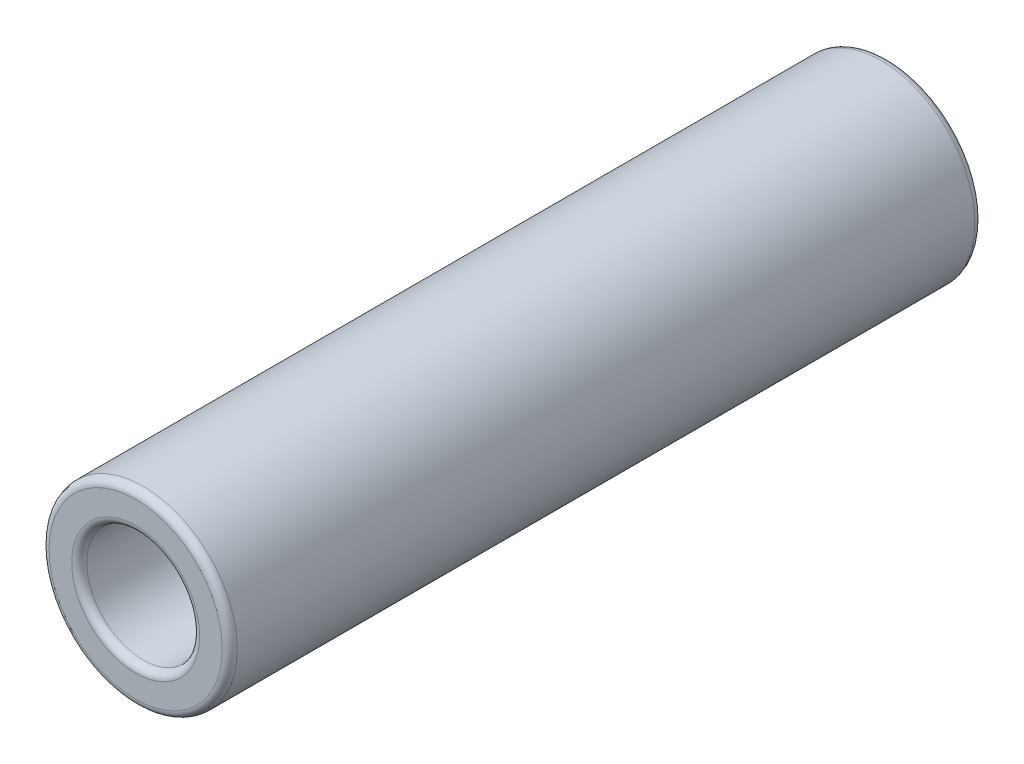
ISO-10303-21;
HEADER;
FILE_DESCRIPTION(('STEP AP214'),'2;1');
FILE_NAME('part.step','',(''),(''),'','','');
FILE_SCHEMA(('AUTOMOTIVE_DESIGN { 1 0 10303 214 1 1 1 1 }'));
ENDSEC;
DATA;
#1=APPLICATION_CONTEXT('core data for automotive mechanical design processes');
#2=APPLICATION_PROTOCOL_DEFINITION('international standard','automotive_design',2000,#1);
#3=PRODUCT_CONTEXT('',#1,'mechanical');
#4=PRODUCT('Part','Part','',(#3));
#5=PRODUCT_RELATED_PRODUCT_CATEGORY('part','',(#4));
#6=PRODUCT_DEFINITION_FORMATION('','',#4);
#7=PRODUCT_DEFINITION_CONTEXT('part definition',#1,'design');
#8=PRODUCT_DEFINITION('design','',#6,#7);
#9=PRODUCT_DEFINITION_SHAPE('','',#8);
#10=(LENGTH_UNIT() NAMED_UNIT(*) SI_UNIT(.MILLI.,.METRE.));
#11=(NAMED_UNIT(*) PLANE_ANGLE_UNIT() SI_UNIT($,.RADIAN.));
#12=(NAMED_UNIT(*) SI_UNIT($,.STERADIAN.) SOLID_ANGLE_UNIT());
#13=UNCERTAINTY_MEASURE_WITH_UNIT(LENGTH_MEASURE(1.E-05),#10,'distance_accuracy_value','');
#14=(GEOMETRIC_REPRESENTATION_CONTEXT(3) GLOBAL_UNCERTAINTY_ASSIGNED_CONTEXT((#13)) GLOBAL_UNIT_ASSIGNED_CONTEXT((#10,
#11,#12)) REPRESENTATION_CONTEXT('',''));
#15=CARTESIAN_POINT('',(0.,0.,0.));
#16=DIRECTION('',(0.,0.,1.));
#17=DIRECTION('',(1.,0.,0.));
#18=AXIS2_PLACEMENT_3D('',#15,#16,#17);
#19=CARTESIAN_POINT('',(0.,0.,50.));
#20=DIRECTION('',(0.,0.,1.));
#21=DIRECTION('',(1.,0.,0.));
#22=AXIS2_PLACEMENT_3D('',#19,#20,#21);
#23=PLANE('',#22);
#24=CARTESIAN_POINT('',(0.,0.,50.));
#25=DIRECTION('',(0.,0.,1.));
#26=DIRECTION('',(1.,0.,0.));
#27=AXIS2_PLACEMENT_3D('',#24,#25,#26);
#28=CIRCLE('',#27,4.25);
#29=CARTESIAN_POINT('',(4.25,0.,50.));
#30=VERTEX_POINT('',#29);
#31=EDGE_CURVE('E10',#30,#30,#28,.F.);
#32=ORIENTED_EDGE('',*,*,#31,.T.);
#33=EDGE_LOOP('',(#32));
#34=FACE_BOUND('',#33,.T.);
#35=CARTESIAN_POINT('',(0.,0.,50.));
#36=DIRECTION('',(0.,0.,1.));
#37=DIRECTION('',(1.,0.,0.));
#38=AXIS2_PLACEMENT_3D('',#35,#36,#37);
#39=CIRCLE('',#38,5.75);
#40=CARTESIAN_POINT('',(5.75,0.,50.));
#41=VERTEX_POINT('',#40);
#42=EDGE_CURVE('E41',#41,#41,#39,.T.);
#43=ORIENTED_EDGE('',*,*,#42,.T.);
#44=EDGE_LOOP('',(#43));
#45=FACE_BOUND('',#44,.T.);
#46=ADVANCED_FACE('F34',(#34,#45),#23,.T.);
#47=CARTESIAN_POINT('',(0.,0.,0.));
#48=DIRECTION('',(0.,0.,1.));
#49=DIRECTION('',(1.,0.,0.));
#50=AXIS2_PLACEMENT_3D('',#47,#48,#49);
#51=PLANE('',#50);
#52=CARTESIAN_POINT('',(0.,0.,0.));
#53=DIRECTION('',(0.,0.,1.));
#54=DIRECTION('',(1.,0.,0.));
#55=AXIS2_PLACEMENT_3D('',#52,#53,#54);
#56=CIRCLE('',#55,4.25);
#57=CARTESIAN_POINT('',(4.25,0.,0.));
#58=VERTEX_POINT('',#57);
#59=EDGE_CURVE('E60',#58,#58,#56,.T.);
#60=ORIENTED_EDGE('',*,*,#59,.T.);
#61=EDGE_LOOP('',(#60));
#62=FACE_BOUND('',#61,.T.);
#63=CARTESIAN_POINT('',(0.,0.,0.));
#64=DIRECTION('',(0.,0.,1.));
#65=DIRECTION('',(1.,0.,0.));
#66=AXIS2_PLACEMENT_3D('',#63,#64,#65);
#67=CIRCLE('',#66,5.75);
#68=CARTESIAN_POINT('',(5.75,0.,0.));
#69=VERTEX_POINT('',#68);
#70=EDGE_CURVE('E63',#69,#69,#67,.F.);
#71=ORIENTED_EDGE('',*,*,#70,.T.);
#72=EDGE_LOOP('',(#71));
#73=FACE_BOUND('',#72,.T.);
#74=ADVANCED_FACE('F67',(#62,#73),#51,.F.);
#75=CARTESIAN_POINT('',(0.,0.,50.));
#76=DIRECTION('',(0.,0.,-1.));
#77=DIRECTION('',(-1.,0.,0.));
#78=AXIS2_PLACEMENT_3D('',#75,#76,#77);
#79=CYLINDRICAL_SURFACE('',#78,6.25);
#80=CARTESIAN_POINT('',(0.,0.,0.5));
#81=DIRECTION('',(0.,0.,1.));
#82=DIRECTION('',(1.,0.,0.));
#83=AXIS2_PLACEMENT_3D('',#80,#81,#82);
#84=CIRCLE('',#83,6.25);
#85=CARTESIAN_POINT('',(6.25,0.,0.5));
#86=VERTEX_POINT('',#85);
#87=EDGE_CURVE('E45',#86,#86,#84,.T.);
#88=ORIENTED_EDGE('',*,*,#87,.T.);
#89=EDGE_LOOP('',(#88));
#90=FACE_BOUND('',#89,.T.);
#91=CARTESIAN_POINT('',(0.,0.,49.5));
#92=DIRECTION('',(0.,0.,1.));
#93=DIRECTION('',(1.,0.,0.));
#94=AXIS2_PLACEMENT_3D('',#91,#92,#93);
#95=CIRCLE('',#94,6.25);
#96=CARTESIAN_POINT('',(6.25,0.,49.5));
#97=VERTEX_POINT('',#96);
#98=EDGE_CURVE('E49',#97,#97,#95,.F.);
#99=ORIENTED_EDGE('',*,*,#98,.T.);
#100=EDGE_LOOP('',(#99));
#101=FACE_BOUND('',#100,.T.);
#102=ADVANCED_FACE('F77',(#90,#101),#79,.T.);
#103=CARTESIAN_POINT('',(0.,0.,50.));
#104=DIRECTION('',(0.,0.,-1.));
#105=DIRECTION('',(-1.,0.,0.));
#106=AXIS2_PLACEMENT_3D('',#103,#104,#105);
#107=CYLINDRICAL_SURFACE('',#106,3.75);
#108=CARTESIAN_POINT('',(0.,0.,0.5));
#109=DIRECTION('',(0.,0.,1.));
#110=DIRECTION('',(1.,0.,0.));
#111=AXIS2_PLACEMENT_3D('',#108,#109,#110);
#112=CIRCLE('',#111,3.75);
#113=CARTESIAN_POINT('',(3.75,0.,0.5));
#114=VERTEX_POINT('',#113);
#115=EDGE_CURVE('E54',#114,#114,#112,.F.);
#116=ORIENTED_EDGE('',*,*,#115,.T.);
#117=EDGE_LOOP('',(#116));
#118=FACE_BOUND('',#117,.T.);
#119=CARTESIAN_POINT('',(0.,0.,49.5));
#120=DIRECTION('',(0.,0.,1.));
#121=DIRECTION('',(1.,0.,0.));
#122=AXIS2_PLACEMENT_3D('',#119,#120,#121);
#123=CIRCLE('',#122,3.75);
#124=CARTESIAN_POINT('',(3.75,0.,49.5));
#125=VERTEX_POINT('',#124);
#126=EDGE_CURVE('E57',#125,#125,#123,.T.);
#127=ORIENTED_EDGE('',*,*,#126,.T.);
#128=EDGE_LOOP('',(#127));
#129=FACE_BOUND('',#128,.T.);
#130=ADVANCED_FACE('F80',(#118,#129),#107,.F.);
#131=CARTESIAN_POINT('',(0.,0.,0.5));
#132=DIRECTION('',(0.,0.,1.));
#133=DIRECTION('',(1.,0.,0.));
#134=AXIS2_PLACEMENT_3D('',#131,#132,#133);
#135=TOROIDAL_SURFACE('',#134,4.25,0.5);
#136=ORIENTED_EDGE('',*,*,#115,.F.);
#137=EDGE_LOOP('',(#136));
#138=FACE_BOUND('',#137,.T.);
#139=ORIENTED_EDGE('',*,*,#59,.F.);
#140=EDGE_LOOP('',(#139));
#141=FACE_BOUND('',#140,.T.);
#142=ADVANCED_FACE('F73',(#138,#141),#135,.T.);
#143=CARTESIAN_POINT('',(0.,0.,0.5));
#144=DIRECTION('',(0.,0.,1.));
#145=DIRECTION('',(1.,0.,0.));
#146=AXIS2_PLACEMENT_3D('',#143,#144,#145);
#147=TOROIDAL_SURFACE('',#146,5.75,0.5);
#148=ORIENTED_EDGE('',*,*,#70,.F.);
#149=EDGE_LOOP('',(#148));
#150=FACE_BOUND('',#149,.T.);
#151=ORIENTED_EDGE('',*,*,#87,.F.);
#152=EDGE_LOOP('',(#151));
#153=FACE_BOUND('',#152,.T.);
#154=ADVANCED_FACE('F69',(#150,#153),#147,.T.);
#155=CARTESIAN_POINT('',(0.,0.,49.5));
#156=DIRECTION('',(0.,0.,1.));
#157=DIRECTION('',(1.,0.,0.));
#158=AXIS2_PLACEMENT_3D('',#155,#156,#157);
#159=TOROIDAL_SURFACE('',#158,4.25,0.5);
#160=ORIENTED_EDGE('',*,*,#31,.F.);
#161=EDGE_LOOP('',(#160));
#162=FACE_BOUND('',#161,.T.);
#163=ORIENTED_EDGE('',*,*,#126,.F.);
#164=EDGE_LOOP('',(#163));
#165=FACE_BOUND('',#164,.T.);
#166=ADVANCED_FACE('F72',(#162,#165),#159,.T.);
#167=CARTESIAN_POINT('',(0.,0.,49.5));
#168=DIRECTION('',(0.,0.,1.));
#169=DIRECTION('',(1.,0.,0.));
#170=AXIS2_PLACEMENT_3D('',#167,#168,#169);
#171=TOROIDAL_SURFACE('',#170,5.75,0.5);
#172=ORIENTED_EDGE('',*,*,#98,.F.);
#173=EDGE_LOOP('',(#172));
#174=FACE_BOUND('',#173,.T.);
#175=ORIENTED_EDGE('',*,*,#42,.F.);
#176=EDGE_LOOP('',(#175));
#177=FACE_BOUND('',#176,.T.);
#178=ADVANCED_FACE('F36',(#174,#177),#171,.T.);
#179=CLOSED_SHELL('',(#46,#74,#102,#130,#142,#154,#166,#178));
#180=MANIFOLD_SOLID_BREP('B2',#179);
#181=ADVANCED_BREP_SHAPE_REPRESENTATION('',(#18,#180),#14);
#182=SHAPE_DEFINITION_REPRESENTATION(#9,#181);
ENDSEC;
END-ISO-10303-21;
